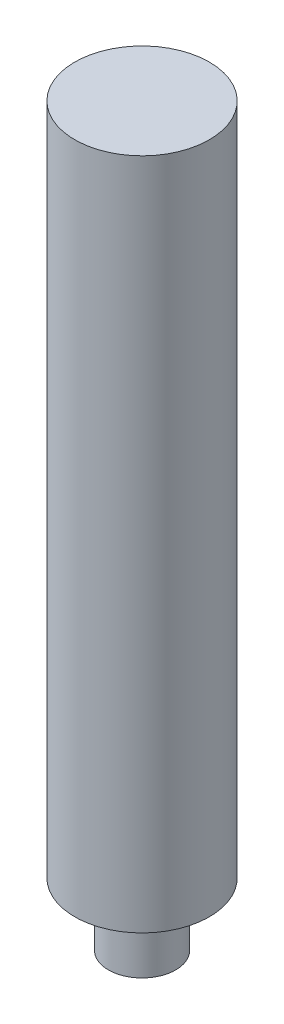
ISO-10303-21;
HEADER;
FILE_DESCRIPTION(('STEP AP214'),'2;1');
FILE_NAME('part.step','',(''),(''),'','','');
FILE_SCHEMA(('AUTOMOTIVE_DESIGN { 1 0 10303 214 1 1 1 1 }'));
ENDSEC;
DATA;
#1=APPLICATION_CONTEXT('core data for automotive mechanical design processes');
#2=APPLICATION_PROTOCOL_DEFINITION('international standard','automotive_design',2000,#1);
#3=PRODUCT_CONTEXT('',#1,'mechanical');
#4=PRODUCT('Part','Part','',(#3));
#5=PRODUCT_RELATED_PRODUCT_CATEGORY('part','',(#4));
#6=PRODUCT_DEFINITION_FORMATION('','',#4);
#7=PRODUCT_DEFINITION_CONTEXT('part definition',#1,'design');
#8=PRODUCT_DEFINITION('design','',#6,#7);
#9=PRODUCT_DEFINITION_SHAPE('','',#8);
#10=(LENGTH_UNIT() NAMED_UNIT(*) SI_UNIT(.MILLI.,.METRE.));
#11=(NAMED_UNIT(*) PLANE_ANGLE_UNIT() SI_UNIT($,.RADIAN.));
#12=(NAMED_UNIT(*) SI_UNIT($,.STERADIAN.) SOLID_ANGLE_UNIT());
#13=UNCERTAINTY_MEASURE_WITH_UNIT(LENGTH_MEASURE(1.E-05),#10,'distance_accuracy_value','');
#14=(GEOMETRIC_REPRESENTATION_CONTEXT(3) GLOBAL_UNCERTAINTY_ASSIGNED_CONTEXT((#13)) GLOBAL_UNIT_ASSIGNED_CONTEXT((#10,
#11,#12)) REPRESENTATION_CONTEXT('',''));
#15=CARTESIAN_POINT('',(0.,0.,0.));
#16=DIRECTION('',(0.,0.,1.));
#17=DIRECTION('',(1.,0.,0.));
#18=AXIS2_PLACEMENT_3D('',#15,#16,#17);
#19=CARTESIAN_POINT('',(0.,2.8,0.));
#20=DIRECTION('',(0.,-1.,0.));
#21=DIRECTION('',(0.,0.,-1.));
#22=AXIS2_PLACEMENT_3D('',#19,#20,#21);
#23=CYLINDRICAL_SURFACE('',#22,1.5);
#24=CARTESIAN_POINT('',(0.,2.8,0.));
#25=DIRECTION('',(0.,1.,0.));
#26=DIRECTION('',(0.,0.,1.));
#27=AXIS2_PLACEMENT_3D('',#24,#25,#26);
#28=CIRCLE('',#27,1.5);
#29=CARTESIAN_POINT('',(0.,2.8,1.5));
#30=VERTEX_POINT('',#29);
#31=EDGE_CURVE('E10',#30,#30,#28,.T.);
#32=ORIENTED_EDGE('',*,*,#31,.F.);
#33=EDGE_LOOP('',(#32));
#34=FACE_BOUND('',#33,.T.);
#35=CARTESIAN_POINT('',(0.,0.,0.));
#36=DIRECTION('',(0.,1.,0.));
#37=DIRECTION('',(0.,0.,1.));
#38=AXIS2_PLACEMENT_3D('',#35,#36,#37);
#39=CIRCLE('',#38,1.5);
#40=CARTESIAN_POINT('',(0.,0.,1.5));
#41=VERTEX_POINT('',#40);
#42=EDGE_CURVE('E38',#41,#41,#39,.T.);
#43=ORIENTED_EDGE('',*,*,#42,.T.);
#44=EDGE_LOOP('',(#43));
#45=FACE_BOUND('',#44,.T.);
#46=ADVANCED_FACE('F35',(#34,#45),#23,.T.);
#47=CARTESIAN_POINT('',(0.,0.,0.));
#48=DIRECTION('',(0.,1.,0.));
#49=DIRECTION('',(0.,0.,1.));
#50=AXIS2_PLACEMENT_3D('',#47,#48,#49);
#51=PLANE('',#50);
#52=ORIENTED_EDGE('',*,*,#42,.F.);
#53=EDGE_LOOP('',(#52));
#54=FACE_BOUND('',#53,.T.);
#55=ADVANCED_FACE('F58',(#54),#51,.F.);
#56=CARTESIAN_POINT('',(0.,32.8,0.));
#57=DIRECTION('',(0.,-1.,0.));
#58=DIRECTION('',(0.,0.,-1.));
#59=AXIS2_PLACEMENT_3D('',#56,#57,#58);
#60=CYLINDRICAL_SURFACE('',#59,3.);
#61=CARTESIAN_POINT('',(0.,32.8,0.));
#62=DIRECTION('',(0.,1.,0.));
#63=DIRECTION('',(0.,0.,1.));
#64=AXIS2_PLACEMENT_3D('',#61,#62,#63);
#65=CIRCLE('',#64,3.);
#66=CARTESIAN_POINT('',(0.,32.8,-3.));
#67=VERTEX_POINT('',#66);
#68=EDGE_CURVE('E45',#67,#67,#65,.T.);
#69=CARTESIAN_POINT('',(0.,2.8,0.));
#70=DIRECTION('',(0.,1.,0.));
#71=DIRECTION('',(0.,0.,1.));
#72=AXIS2_PLACEMENT_3D('',#69,#70,#71);
#73=CIRCLE('',#72,3.);
#74=CARTESIAN_POINT('',(0.,2.8,-3.));
#75=VERTEX_POINT('',#74);
#76=EDGE_CURVE('E47',#75,#75,#73,.T.);
#77=CARTESIAN_POINT('',(0.,32.8,-3.));
#78=CARTESIAN_POINT('',(0.,32.4875,-3.));
#79=CARTESIAN_POINT('',(0.,32.175,-3.));
#80=CARTESIAN_POINT('',(0.,31.55,-3.));
#81=CARTESIAN_POINT('',(0.,31.2375,-3.));
#82=CARTESIAN_POINT('',(0.,30.6125,-3.));
#83=CARTESIAN_POINT('',(0.,30.3,-3.));
#84=CARTESIAN_POINT('',(0.,29.675,-3.));
#85=CARTESIAN_POINT('',(0.,29.3625,-3.));
#86=CARTESIAN_POINT('',(0.,28.7375,-3.));
#87=CARTESIAN_POINT('',(0.,28.425,-3.));
#88=CARTESIAN_POINT('',(0.,27.8,-3.));
#89=CARTESIAN_POINT('',(0.,27.4875,-3.));
#90=CARTESIAN_POINT('',(0.,26.8625,-3.));
#91=CARTESIAN_POINT('',(0.,26.55,-3.));
#92=CARTESIAN_POINT('',(0.,25.925,-3.));
#93=CARTESIAN_POINT('',(0.,25.6125,-3.));
#94=CARTESIAN_POINT('',(0.,24.9875,-3.));
#95=CARTESIAN_POINT('',(0.,24.675,-3.));
#96=CARTESIAN_POINT('',(0.,24.05,-3.));
#97=CARTESIAN_POINT('',(0.,23.7375,-3.));
#98=CARTESIAN_POINT('',(0.,23.1125,-3.));
#99=CARTESIAN_POINT('',(0.,22.8,-3.));
#100=CARTESIAN_POINT('',(0.,22.175,-3.));
#101=CARTESIAN_POINT('',(0.,21.8625,-3.));
#102=CARTESIAN_POINT('',(0.,21.2375,-3.));
#103=CARTESIAN_POINT('',(0.,20.925,-3.));
#104=CARTESIAN_POINT('',(0.,20.3,-3.));
#105=CARTESIAN_POINT('',(0.,19.9875,-3.));
#106=CARTESIAN_POINT('',(0.,19.3625,-3.));
#107=CARTESIAN_POINT('',(0.,19.05,-3.));
#108=CARTESIAN_POINT('',(0.,18.425,-3.));
#109=CARTESIAN_POINT('',(0.,18.1125,-3.));
#110=CARTESIAN_POINT('',(0.,17.4875,-3.));
#111=CARTESIAN_POINT('',(0.,17.175,-3.));
#112=CARTESIAN_POINT('',(0.,16.55,-3.));
#113=CARTESIAN_POINT('',(0.,16.2375,-3.));
#114=CARTESIAN_POINT('',(0.,15.6125,-3.));
#115=CARTESIAN_POINT('',(0.,15.3,-3.));
#116=CARTESIAN_POINT('',(0.,14.675,-3.));
#117=CARTESIAN_POINT('',(0.,14.3625,-3.));
#118=CARTESIAN_POINT('',(0.,13.7375,-3.));
#119=CARTESIAN_POINT('',(0.,13.425,-3.));
#120=CARTESIAN_POINT('',(0.,12.8,-3.));
#121=CARTESIAN_POINT('',(0.,12.4875,-3.));
#122=CARTESIAN_POINT('',(0.,11.8625,-3.));
#123=CARTESIAN_POINT('',(0.,11.55,-3.));
#124=CARTESIAN_POINT('',(0.,10.925,-3.));
#125=CARTESIAN_POINT('',(0.,10.6125,-3.));
#126=CARTESIAN_POINT('',(0.,9.9875,-3.));
#127=CARTESIAN_POINT('',(0.,9.675,-3.));
#128=CARTESIAN_POINT('',(0.,9.05,-3.));
#129=CARTESIAN_POINT('',(0.,8.7375,-3.));
#130=CARTESIAN_POINT('',(0.,8.1125,-3.));
#131=CARTESIAN_POINT('',(0.,7.8,-3.));
#132=CARTESIAN_POINT('',(0.,7.175,-3.));
#133=CARTESIAN_POINT('',(0.,6.8625,-3.));
#134=CARTESIAN_POINT('',(0.,6.2375,-3.));
#135=CARTESIAN_POINT('',(0.,5.925,-3.));
#136=CARTESIAN_POINT('',(0.,5.3,-3.));
#137=CARTESIAN_POINT('',(0.,4.9875,-3.));
#138=CARTESIAN_POINT('',(0.,4.3625,-3.));
#139=CARTESIAN_POINT('',(0.,4.05,-3.));
#140=CARTESIAN_POINT('',(0.,3.425,-3.));
#141=CARTESIAN_POINT('',(0.,3.1125,-3.));
#142=CARTESIAN_POINT('',(0.,2.8,-3.));
#143=B_SPLINE_CURVE_WITH_KNOTS('',3,(#77,#78,#79,#80,#81,#82,#83,#84,#85,#86,#87,#88,#89,#90,
#91,#92,#93,#94,#95,#96,#97,#98,#99,#100,#101,#102,#103,#104,#105,#106,#107,#108,#109,#110,#111,
#112,#113,#114,#115,#116,#117,#118,#119,#120,#121,#122,#123,#124,#125,#126,#127,#128,#129,#130,
#131,#132,#133,#134,#135,#136,#137,#138,#139,#140,#141,#142),.UNSPECIFIED.,.F.,.F.,(4,2,2,2,2,2,
2,2,2,2,2,2,2,2,2,2,2,2,2,2,2,2,2,2,2,2,2,2,2,2,2,2,4),(0.,0.937500000000001,1.875,2.8125,3.75,
4.6875,5.62500000000001,6.5625,7.5,8.4375,9.375,10.3125,11.25,12.1875,13.125,14.0625,15.,
15.9375,16.875,17.8125,18.75,19.6875,20.625,21.5625,22.5,23.4375,24.375,25.3125,26.25,27.1875,
28.125,29.0625,30.),.UNSPECIFIED.);
#144=EDGE_CURVE('BSEAM55',#67,#75,#143,.T.);
#145=ORIENTED_EDGE('',*,*,#68,.F.);
#146=ORIENTED_EDGE('',*,*,#76,.T.);
#147=ORIENTED_EDGE('',*,*,#144,.T.);
#148=ORIENTED_EDGE('',*,*,#144,.F.);
#149=EDGE_LOOP('',(#145,#147,#146,#148));
#150=FACE_BOUND('',#149,.T.);
#151=ADVANCED_FACE('F55',(#150),#60,.T.);
#152=CARTESIAN_POINT('',(0.,32.8,0.));
#153=DIRECTION('',(0.,1.,0.));
#154=DIRECTION('',(0.,0.,1.));
#155=AXIS2_PLACEMENT_3D('',#152,#153,#154);
#156=PLANE('',#155);
#157=ORIENTED_EDGE('',*,*,#68,.T.);
#158=EDGE_LOOP('',(#157));
#159=FACE_BOUND('',#158,.T.);
#160=ADVANCED_FACE('F53',(#159),#156,.T.);
#161=CARTESIAN_POINT('',(0.,2.8,0.));
#162=DIRECTION('',(0.,1.,0.));
#163=DIRECTION('',(0.,0.,1.));
#164=AXIS2_PLACEMENT_3D('',#161,#162,#163);
#165=PLANE('',#164);
#166=ORIENTED_EDGE('',*,*,#31,.T.);
#167=EDGE_LOOP('',(#166));
#168=FACE_BOUND('',#167,.T.);
#169=ORIENTED_EDGE('',*,*,#76,.F.);
#170=EDGE_LOOP('',(#169));
#171=FACE_BOUND('',#170,.T.);
#172=ADVANCED_FACE('F62',(#168,#171),#165,.F.);
#173=CLOSED_SHELL('',(#46,#55,#151,#160,#172));
#174=MANIFOLD_SOLID_BREP('B2',#173);
#175=ADVANCED_BREP_SHAPE_REPRESENTATION('',(#18,#174),#14);
#176=SHAPE_DEFINITION_REPRESENTATION(#9,#175);
ENDSEC;
END-ISO-10303-21;
